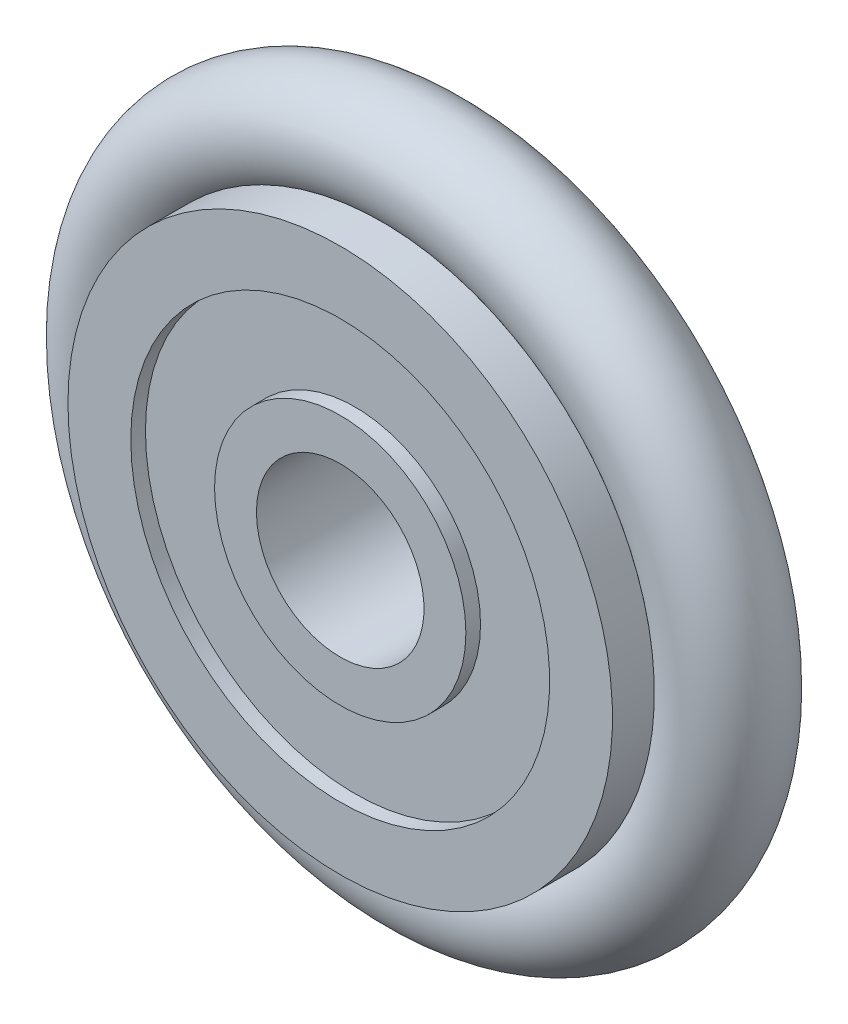
ISO-10303-21;
HEADER;
FILE_DESCRIPTION(('STEP AP214'),'2;1');
FILE_NAME('part.step','',(''),(''),'','','');
FILE_SCHEMA(('AUTOMOTIVE_DESIGN { 1 0 10303 214 1 1 1 1 }'));
ENDSEC;
DATA;
#1=APPLICATION_CONTEXT('core data for automotive mechanical design processes');
#2=APPLICATION_PROTOCOL_DEFINITION('international standard','automotive_design',2000,#1);
#3=PRODUCT_CONTEXT('',#1,'mechanical');
#4=PRODUCT('Part','Part','',(#3));
#5=PRODUCT_RELATED_PRODUCT_CATEGORY('part','',(#4));
#6=PRODUCT_DEFINITION_FORMATION('','',#4);
#7=PRODUCT_DEFINITION_CONTEXT('part definition',#1,'design');
#8=PRODUCT_DEFINITION('design','',#6,#7);
#9=PRODUCT_DEFINITION_SHAPE('','',#8);
#10=(LENGTH_UNIT() NAMED_UNIT(*) SI_UNIT(.MILLI.,.METRE.));
#11=(NAMED_UNIT(*) PLANE_ANGLE_UNIT() SI_UNIT($,.RADIAN.));
#12=(NAMED_UNIT(*) SI_UNIT($,.STERADIAN.) SOLID_ANGLE_UNIT());
#13=UNCERTAINTY_MEASURE_WITH_UNIT(LENGTH_MEASURE(1.E-05),#10,'distance_accuracy_value','');
#14=(GEOMETRIC_REPRESENTATION_CONTEXT(3) GLOBAL_UNCERTAINTY_ASSIGNED_CONTEXT((#13)) GLOBAL_UNIT_ASSIGNED_CONTEXT((#10,
#11,#12)) REPRESENTATION_CONTEXT('',''));
#15=CARTESIAN_POINT('',(0.,0.,0.));
#16=DIRECTION('',(0.,0.,1.));
#17=DIRECTION('',(1.,0.,0.));
#18=AXIS2_PLACEMENT_3D('',#15,#16,#17);
#19=CARTESIAN_POINT('',(0.,0.,0.));
#20=DIRECTION('',(0.,0.,1.));
#21=DIRECTION('',(1.,0.,0.));
#22=AXIS2_PLACEMENT_3D('',#19,#20,#21);
#23=TOROIDAL_SURFACE('',#22,7.25,1.25);
#24=CARTESIAN_POINT('',(8.5,0.,0.));
#25=VERTEX_POINT('',#24);
#26=VERTEX_LOOP('',#25);
#27=FACE_BOUND('',#26,.T.);
#28=ADVANCED_FACE('F47',(#27),#23,.T.);
#29=CLOSED_SHELL('',(#28));
#30=MANIFOLD_SOLID_BREP('B2',#29);
#31=CARTESIAN_POINT('',(2.,0.,-2.));
#32=DIRECTION('',(0.,0.,1.));
#33=DIRECTION('',(1.,0.,0.));
#34=AXIS2_PLACEMENT_3D('',#31,#32,#33);
#35=PLANE('',#34);
#36=CARTESIAN_POINT('',(0.,0.,-2.));
#37=DIRECTION('',(0.,0.,-1.));
#38=DIRECTION('',(-1.,0.,0.));
#39=AXIS2_PLACEMENT_3D('',#36,#37,#38);
#40=CIRCLE('',#39,2.);
#41=CARTESIAN_POINT('',(-2.,0.,-2.));
#42=VERTEX_POINT('',#41);
#43=EDGE_CURVE('E119',#42,#42,#40,.T.);
#44=ORIENTED_EDGE('',*,*,#43,.F.);
#45=EDGE_LOOP('',(#44));
#46=FACE_BOUND('',#45,.T.);
#47=CARTESIAN_POINT('',(0.,0.,-2.));
#48=DIRECTION('',(0.,0.,-1.));
#49=DIRECTION('',(-1.,0.,0.));
#50=AXIS2_PLACEMENT_3D('',#47,#48,#49);
#51=CIRCLE('',#50,3.);
#52=CARTESIAN_POINT('',(-3.,0.,-2.));
#53=VERTEX_POINT('',#52);
#54=EDGE_CURVE('E46',#53,#53,#51,.T.);
#55=ORIENTED_EDGE('',*,*,#54,.T.);
#56=EDGE_LOOP('',(#55));
#57=FACE_BOUND('',#56,.T.);
#58=ADVANCED_FACE('F60',(#46,#57),#35,.F.);
#59=CARTESIAN_POINT('',(0.,0.,-2.));
#60=DIRECTION('',(0.,0.,-1.));
#61=DIRECTION('',(-1.,0.,0.));
#62=AXIS2_PLACEMENT_3D('',#59,#60,#61);
#63=CYLINDRICAL_SURFACE('',#62,3.);
#64=ORIENTED_EDGE('',*,*,#54,.F.);
#65=EDGE_LOOP('',(#64));
#66=FACE_BOUND('',#65,.T.);
#67=CARTESIAN_POINT('',(0.,0.,-1.65));
#68=DIRECTION('',(0.,0.,-1.));
#69=DIRECTION('',(-1.,0.,0.));
#70=AXIS2_PLACEMENT_3D('',#67,#68,#69);
#71=CIRCLE('',#70,3.);
#72=CARTESIAN_POINT('',(-3.,0.,-1.65));
#73=VERTEX_POINT('',#72);
#74=EDGE_CURVE('E67',#73,#73,#71,.T.);
#75=ORIENTED_EDGE('',*,*,#74,.T.);
#76=EDGE_LOOP('',(#75));
#77=FACE_BOUND('',#76,.T.);
#78=ADVANCED_FACE('F127',(#66,#77),#63,.T.);
#79=CARTESIAN_POINT('',(3.,0.,-1.65));
#80=DIRECTION('',(0.,0.,1.));
#81=DIRECTION('',(1.,0.,0.));
#82=AXIS2_PLACEMENT_3D('',#79,#80,#81);
#83=PLANE('',#82);
#84=ORIENTED_EDGE('',*,*,#74,.F.);
#85=EDGE_LOOP('',(#84));
#86=FACE_BOUND('',#85,.T.);
#87=CARTESIAN_POINT('',(0.,0.,-1.65));
#88=DIRECTION('',(0.,0.,-1.));
#89=DIRECTION('',(-1.,0.,0.));
#90=AXIS2_PLACEMENT_3D('',#87,#88,#89);
#91=CIRCLE('',#90,5.);
#92=CARTESIAN_POINT('',(-5.,0.,-1.65));
#93=VERTEX_POINT('',#92);
#94=EDGE_CURVE('E72',#93,#93,#91,.T.);
#95=ORIENTED_EDGE('',*,*,#94,.T.);
#96=EDGE_LOOP('',(#95));
#97=FACE_BOUND('',#96,.T.);
#98=ADVANCED_FACE('F131',(#86,#97),#83,.F.);
#99=CARTESIAN_POINT('',(0.,0.,-2.));
#100=DIRECTION('',(0.,0.,-1.));
#101=DIRECTION('',(-1.,0.,0.));
#102=AXIS2_PLACEMENT_3D('',#99,#100,#101);
#103=CYLINDRICAL_SURFACE('',#102,5.);
#104=ORIENTED_EDGE('',*,*,#94,.F.);
#105=EDGE_LOOP('',(#104));
#106=FACE_BOUND('',#105,.T.);
#107=CARTESIAN_POINT('',(0.,0.,-2.));
#108=DIRECTION('',(0.,0.,-1.));
#109=DIRECTION('',(-1.,0.,0.));
#110=AXIS2_PLACEMENT_3D('',#107,#108,#109);
#111=CIRCLE('',#110,5.);
#112=CARTESIAN_POINT('',(-5.,0.,-2.));
#113=VERTEX_POINT('',#112);
#114=EDGE_CURVE('E77',#113,#113,#111,.T.);
#115=ORIENTED_EDGE('',*,*,#114,.T.);
#116=EDGE_LOOP('',(#115));
#117=FACE_BOUND('',#116,.T.);
#118=ADVANCED_FACE('F136',(#106,#117),#103,.F.);
#119=CARTESIAN_POINT('',(5.,0.,-2.));
#120=DIRECTION('',(0.,0.,1.));
#121=DIRECTION('',(1.,0.,0.));
#122=AXIS2_PLACEMENT_3D('',#119,#120,#121);
#123=PLANE('',#122);
#124=ORIENTED_EDGE('',*,*,#114,.F.);
#125=EDGE_LOOP('',(#124));
#126=FACE_BOUND('',#125,.T.);
#127=CARTESIAN_POINT('',(0.,0.,-2.));
#128=DIRECTION('',(0.,0.,-1.));
#129=DIRECTION('',(-1.,0.,0.));
#130=AXIS2_PLACEMENT_3D('',#127,#128,#129);
#131=CIRCLE('',#130,6.5);
#132=CARTESIAN_POINT('',(-6.5,0.,-2.));
#133=VERTEX_POINT('',#132);
#134=EDGE_CURVE('E83',#133,#133,#131,.T.);
#135=ORIENTED_EDGE('',*,*,#134,.T.);
#136=EDGE_LOOP('',(#135));
#137=FACE_BOUND('',#136,.T.);
#138=ADVANCED_FACE('F142',(#126,#137),#123,.F.);
#139=CARTESIAN_POINT('',(0.,0.,-2.));
#140=DIRECTION('',(0.,0.,-1.));
#141=DIRECTION('',(-1.,0.,0.));
#142=AXIS2_PLACEMENT_3D('',#139,#140,#141);
#143=CYLINDRICAL_SURFACE('',#142,6.5);
#144=ORIENTED_EDGE('',*,*,#134,.F.);
#145=EDGE_LOOP('',(#144));
#146=FACE_BOUND('',#145,.T.);
#147=CARTESIAN_POINT('',(0.,0.,-1.));
#148=DIRECTION('',(0.,0.,-1.));
#149=DIRECTION('',(-1.,0.,0.));
#150=AXIS2_PLACEMENT_3D('',#147,#148,#149);
#151=CIRCLE('',#150,6.5);
#152=CARTESIAN_POINT('',(-6.5,0.,-1.));
#153=VERTEX_POINT('',#152);
#154=EDGE_CURVE('E87',#153,#153,#151,.T.);
#155=ORIENTED_EDGE('',*,*,#154,.T.);
#156=EDGE_LOOP('',(#155));
#157=FACE_BOUND('',#156,.T.);
#158=ADVANCED_FACE('F146',(#146,#157),#143,.T.);
#159=CARTESIAN_POINT('',(0.,0.,0.));
#160=DIRECTION('',(0.,0.,-1.));
#161=DIRECTION('',(-1.,0.,0.));
#162=AXIS2_PLACEMENT_3D('',#159,#160,#161);
#163=TOROIDAL_SURFACE('',#162,7.25,1.25);
#164=ORIENTED_EDGE('',*,*,#154,.F.);
#165=EDGE_LOOP('',(#164));
#166=FACE_BOUND('',#165,.T.);
#167=CARTESIAN_POINT('',(0.,0.,1.));
#168=DIRECTION('',(0.,0.,-1.));
#169=DIRECTION('',(-1.,0.,0.));
#170=AXIS2_PLACEMENT_3D('',#167,#168,#169);
#171=CIRCLE('',#170,6.5);
#172=CARTESIAN_POINT('',(-6.5,0.,1.));
#173=VERTEX_POINT('',#172);
#174=EDGE_CURVE('E91',#173,#173,#171,.T.);
#175=ORIENTED_EDGE('',*,*,#174,.T.);
#176=EDGE_LOOP('',(#175));
#177=FACE_BOUND('',#176,.T.);
#178=ADVANCED_FACE('F150',(#166,#177),#163,.F.);
#179=CARTESIAN_POINT('',(0.,0.,-2.));
#180=DIRECTION('',(0.,0.,-1.));
#181=DIRECTION('',(-1.,0.,0.));
#182=AXIS2_PLACEMENT_3D('',#179,#180,#181);
#183=CYLINDRICAL_SURFACE('',#182,6.5);
#184=ORIENTED_EDGE('',*,*,#174,.F.);
#185=EDGE_LOOP('',(#184));
#186=FACE_BOUND('',#185,.T.);
#187=CARTESIAN_POINT('',(0.,0.,2.));
#188=DIRECTION('',(0.,0.,-1.));
#189=DIRECTION('',(-1.,0.,0.));
#190=AXIS2_PLACEMENT_3D('',#187,#188,#189);
#191=CIRCLE('',#190,6.5);
#192=CARTESIAN_POINT('',(-6.5,0.,2.));
#193=VERTEX_POINT('',#192);
#194=EDGE_CURVE('E95',#193,#193,#191,.T.);
#195=ORIENTED_EDGE('',*,*,#194,.T.);
#196=EDGE_LOOP('',(#195));
#197=FACE_BOUND('',#196,.T.);
#198=ADVANCED_FACE('F154',(#186,#197),#183,.T.);
#199=CARTESIAN_POINT('',(5.,0.,2.));
#200=DIRECTION('',(0.,0.,-1.));
#201=DIRECTION('',(-1.,0.,0.));
#202=AXIS2_PLACEMENT_3D('',#199,#200,#201);
#203=PLANE('',#202);
#204=ORIENTED_EDGE('',*,*,#194,.F.);
#205=EDGE_LOOP('',(#204));
#206=FACE_BOUND('',#205,.T.);
#207=CARTESIAN_POINT('',(0.,0.,2.));
#208=DIRECTION('',(0.,0.,-1.));
#209=DIRECTION('',(-1.,0.,0.));
#210=AXIS2_PLACEMENT_3D('',#207,#208,#209);
#211=CIRCLE('',#210,5.);
#212=CARTESIAN_POINT('',(-5.,0.,2.));
#213=VERTEX_POINT('',#212);
#214=EDGE_CURVE('E99',#213,#213,#211,.T.);
#215=ORIENTED_EDGE('',*,*,#214,.T.);
#216=EDGE_LOOP('',(#215));
#217=FACE_BOUND('',#216,.T.);
#218=ADVANCED_FACE('F158',(#206,#217),#203,.F.);
#219=CARTESIAN_POINT('',(0.,0.,-2.));
#220=DIRECTION('',(0.,0.,-1.));
#221=DIRECTION('',(-1.,0.,0.));
#222=AXIS2_PLACEMENT_3D('',#219,#220,#221);
#223=CYLINDRICAL_SURFACE('',#222,5.);
#224=ORIENTED_EDGE('',*,*,#214,.F.);
#225=EDGE_LOOP('',(#224));
#226=FACE_BOUND('',#225,.T.);
#227=CARTESIAN_POINT('',(0.,0.,1.65));
#228=DIRECTION('',(0.,0.,-1.));
#229=DIRECTION('',(-1.,0.,0.));
#230=AXIS2_PLACEMENT_3D('',#227,#228,#229);
#231=CIRCLE('',#230,5.);
#232=CARTESIAN_POINT('',(-5.,0.,1.65));
#233=VERTEX_POINT('',#232);
#234=EDGE_CURVE('E103',#233,#233,#231,.T.);
#235=ORIENTED_EDGE('',*,*,#234,.T.);
#236=EDGE_LOOP('',(#235));
#237=FACE_BOUND('',#236,.T.);
#238=ADVANCED_FACE('F162',(#226,#237),#223,.F.);
#239=CARTESIAN_POINT('',(3.,0.,1.65));
#240=DIRECTION('',(0.,0.,-1.));
#241=DIRECTION('',(-1.,0.,0.));
#242=AXIS2_PLACEMENT_3D('',#239,#240,#241);
#243=PLANE('',#242);
#244=ORIENTED_EDGE('',*,*,#234,.F.);
#245=EDGE_LOOP('',(#244));
#246=FACE_BOUND('',#245,.T.);
#247=CARTESIAN_POINT('',(0.,0.,1.65));
#248=DIRECTION('',(0.,0.,-1.));
#249=DIRECTION('',(-1.,0.,0.));
#250=AXIS2_PLACEMENT_3D('',#247,#248,#249);
#251=CIRCLE('',#250,3.);
#252=CARTESIAN_POINT('',(-3.,0.,1.65));
#253=VERTEX_POINT('',#252);
#254=EDGE_CURVE('E107',#253,#253,#251,.T.);
#255=ORIENTED_EDGE('',*,*,#254,.T.);
#256=EDGE_LOOP('',(#255));
#257=FACE_BOUND('',#256,.T.);
#258=ADVANCED_FACE('F166',(#246,#257),#243,.F.);
#259=CARTESIAN_POINT('',(0.,0.,-2.));
#260=DIRECTION('',(0.,0.,-1.));
#261=DIRECTION('',(-1.,0.,0.));
#262=AXIS2_PLACEMENT_3D('',#259,#260,#261);
#263=CYLINDRICAL_SURFACE('',#262,3.);
#264=ORIENTED_EDGE('',*,*,#254,.F.);
#265=EDGE_LOOP('',(#264));
#266=FACE_BOUND('',#265,.T.);
#267=CARTESIAN_POINT('',(0.,0.,2.));
#268=DIRECTION('',(0.,0.,-1.));
#269=DIRECTION('',(-1.,0.,0.));
#270=AXIS2_PLACEMENT_3D('',#267,#268,#269);
#271=CIRCLE('',#270,3.);
#272=CARTESIAN_POINT('',(-3.,0.,2.));
#273=VERTEX_POINT('',#272);
#274=EDGE_CURVE('E111',#273,#273,#271,.T.);
#275=ORIENTED_EDGE('',*,*,#274,.T.);
#276=EDGE_LOOP('',(#275));
#277=FACE_BOUND('',#276,.T.);
#278=ADVANCED_FACE('F170',(#266,#277),#263,.T.);
#279=CARTESIAN_POINT('',(2.,0.,2.));
#280=DIRECTION('',(0.,0.,-1.));
#281=DIRECTION('',(-1.,0.,0.));
#282=AXIS2_PLACEMENT_3D('',#279,#280,#281);
#283=PLANE('',#282);
#284=ORIENTED_EDGE('',*,*,#274,.F.);
#285=EDGE_LOOP('',(#284));
#286=FACE_BOUND('',#285,.T.);
#287=CARTESIAN_POINT('',(0.,0.,2.));
#288=DIRECTION('',(0.,0.,-1.));
#289=DIRECTION('',(-1.,0.,0.));
#290=AXIS2_PLACEMENT_3D('',#287,#288,#289);
#291=CIRCLE('',#290,2.);
#292=CARTESIAN_POINT('',(-2.,0.,2.));
#293=VERTEX_POINT('',#292);
#294=EDGE_CURVE('E115',#293,#293,#291,.T.);
#295=ORIENTED_EDGE('',*,*,#294,.T.);
#296=EDGE_LOOP('',(#295));
#297=FACE_BOUND('',#296,.T.);
#298=ADVANCED_FACE('F174',(#286,#297),#283,.F.);
#299=CARTESIAN_POINT('',(0.,0.,-2.));
#300=DIRECTION('',(0.,0.,-1.));
#301=DIRECTION('',(-1.,0.,0.));
#302=AXIS2_PLACEMENT_3D('',#299,#300,#301);
#303=CYLINDRICAL_SURFACE('',#302,2.);
#304=ORIENTED_EDGE('',*,*,#294,.F.);
#305=EDGE_LOOP('',(#304));
#306=FACE_BOUND('',#305,.T.);
#307=ORIENTED_EDGE('',*,*,#43,.T.);
#308=EDGE_LOOP('',(#307));
#309=FACE_BOUND('',#308,.T.);
#310=ADVANCED_FACE('F124',(#306,#309),#303,.F.);
#311=CLOSED_SHELL('',(#58,#78,#98,#118,#138,#158,#178,#198,#218,#238,#258,#278,#298,#310));
#312=MANIFOLD_SOLID_BREP('B6',#311);
#313=ADVANCED_BREP_SHAPE_REPRESENTATION('',(#18,#30,#312),#14);
#314=SHAPE_DEFINITION_REPRESENTATION(#9,#313);
ENDSEC;
END-ISO-10303-21;
